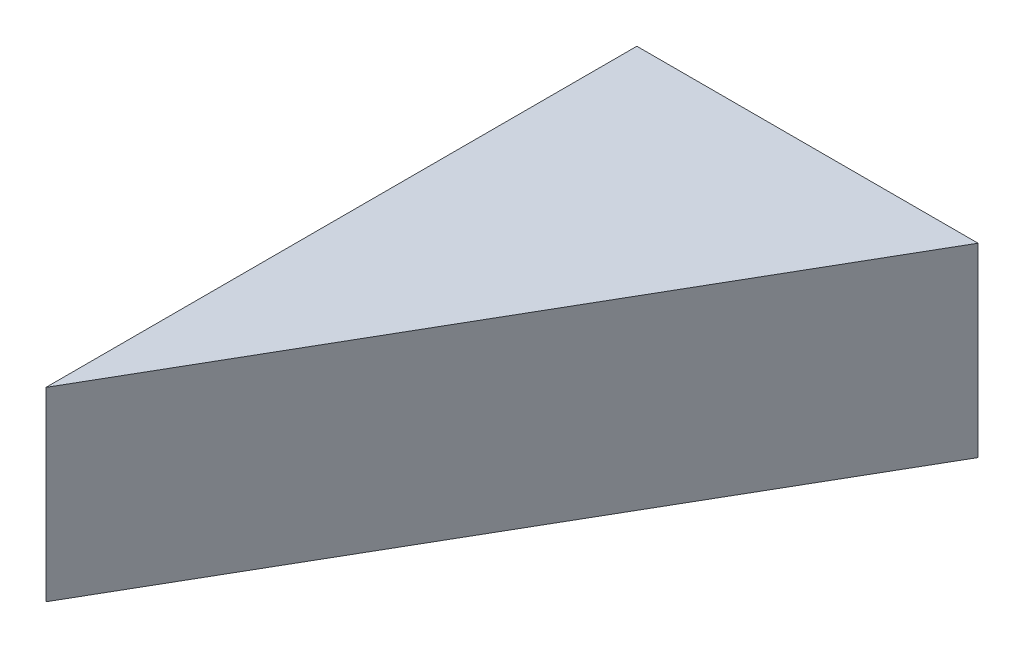
ISO-10303-21;
HEADER;
FILE_DESCRIPTION(('STEP AP214'),'2;1');
FILE_NAME('part.step','',(''),(''),'','','');
FILE_SCHEMA(('AUTOMOTIVE_DESIGN { 1 0 10303 214 1 1 1 1 }'));
ENDSEC;
DATA;
#1=APPLICATION_CONTEXT('core data for automotive mechanical design processes');
#2=APPLICATION_PROTOCOL_DEFINITION('international standard','automotive_design',2000,#1);
#3=PRODUCT_CONTEXT('',#1,'mechanical');
#4=PRODUCT('Part','Part','',(#3));
#5=PRODUCT_RELATED_PRODUCT_CATEGORY('part','',(#4));
#6=PRODUCT_DEFINITION_FORMATION('','',#4);
#7=PRODUCT_DEFINITION_CONTEXT('part definition',#1,'design');
#8=PRODUCT_DEFINITION('design','',#6,#7);
#9=PRODUCT_DEFINITION_SHAPE('','',#8);
#10=(LENGTH_UNIT() NAMED_UNIT(*) SI_UNIT(.MILLI.,.METRE.));
#11=(NAMED_UNIT(*) PLANE_ANGLE_UNIT() SI_UNIT($,.RADIAN.));
#12=(NAMED_UNIT(*) SI_UNIT($,.STERADIAN.) SOLID_ANGLE_UNIT());
#13=UNCERTAINTY_MEASURE_WITH_UNIT(LENGTH_MEASURE(1.E-05),#10,'distance_accuracy_value','');
#14=(GEOMETRIC_REPRESENTATION_CONTEXT(3) GLOBAL_UNCERTAINTY_ASSIGNED_CONTEXT((#13)) GLOBAL_UNIT_ASSIGNED_CONTEXT((#10,
#11,#12)) REPRESENTATION_CONTEXT('',''));
#15=CARTESIAN_POINT('',(0.,0.,0.));
#16=DIRECTION('',(0.,0.,1.));
#17=DIRECTION('',(1.,0.,0.));
#18=AXIS2_PLACEMENT_3D('',#15,#16,#17);
#19=CARTESIAN_POINT('',(0.,-360.,0.));
#20=DIRECTION('',(-1.,0.,0.));
#21=DIRECTION('',(0.,0.,1.));
#22=AXIS2_PLACEMENT_3D('',#19,#20,#21);
#23=PLANE('',#22);
#24=DIRECTION('',(0.,0.,1.));
#25=VECTOR('',#24,1.);
#26=CARTESIAN_POINT('',(0.,-360.,52.5));
#27=LINE('',#26,#25);
#28=CARTESIAN_POINT('',(0.,-360.,0.));
#29=VERTEX_POINT('',#28);
#30=CARTESIAN_POINT('',(0.,-360.,70.));
#31=VERTEX_POINT('',#30);
#32=EDGE_CURVE('E11',#29,#31,#27,.T.);
#33=ORIENTED_EDGE('',*,*,#32,.T.);
#34=DIRECTION('',(0.,1.,0.));
#35=VECTOR('',#34,1.);
#36=CARTESIAN_POINT('',(0.,-360.,70.));
#37=LINE('',#36,#35);
#38=CARTESIAN_POINT('',(0.,-338.,70.));
#39=VERTEX_POINT('',#38);
#40=EDGE_CURVE('E20',#31,#39,#37,.T.);
#41=ORIENTED_EDGE('',*,*,#40,.T.);
#42=DIRECTION('',(0.,0.,1.));
#43=VECTOR('',#42,1.);
#44=CARTESIAN_POINT('',(0.,-338.,52.5));
#45=LINE('',#44,#43);
#46=CARTESIAN_POINT('',(0.,-338.,0.));
#47=VERTEX_POINT('',#46);
#48=EDGE_CURVE('E93',#47,#39,#45,.T.);
#49=ORIENTED_EDGE('',*,*,#48,.F.);
#50=DIRECTION('',(0.,1.,0.));
#51=VECTOR('',#50,1.);
#52=CARTESIAN_POINT('',(0.,-360.,0.));
#53=LINE('',#52,#51);
#54=EDGE_CURVE('E53',#29,#47,#53,.T.);
#55=ORIENTED_EDGE('',*,*,#54,.F.);
#56=EDGE_LOOP('',(#33,#41,#49,#55));
#57=FACE_BOUND('',#56,.T.);
#58=ADVANCED_FACE('F16',(#57),#23,.T.);
#59=CARTESIAN_POINT('',(40.4145188432737,-360.,0.));
#60=DIRECTION('',(0.,0.,-1.));
#61=DIRECTION('',(0.,-1.,0.));
#62=AXIS2_PLACEMENT_3D('',#59,#60,#61);
#63=PLANE('',#62);
#64=DIRECTION('',(-1.,0.,0.));
#65=VECTOR('',#64,1.);
#66=CARTESIAN_POINT('',(10.1036297108184,-360.,0.));
#67=LINE('',#66,#65);
#68=CARTESIAN_POINT('',(40.4145188432737,-360.,0.));
#69=VERTEX_POINT('',#68);
#70=EDGE_CURVE('E70',#69,#29,#67,.T.);
#71=ORIENTED_EDGE('',*,*,#70,.T.);
#72=ORIENTED_EDGE('',*,*,#54,.T.);
#73=DIRECTION('',(-1.,0.,0.));
#74=VECTOR('',#73,1.);
#75=CARTESIAN_POINT('',(10.1036297108184,-338.,0.));
#76=LINE('',#75,#74);
#77=CARTESIAN_POINT('',(40.4145188432737,-338.,0.));
#78=VERTEX_POINT('',#77);
#79=EDGE_CURVE('E63',#78,#47,#76,.T.);
#80=ORIENTED_EDGE('',*,*,#79,.F.);
#81=DIRECTION('',(0.,1.,0.));
#82=VECTOR('',#81,1.);
#83=CARTESIAN_POINT('',(40.4145188432737,-360.,0.));
#84=LINE('',#83,#82);
#85=EDGE_CURVE('E67',#69,#78,#84,.T.);
#86=ORIENTED_EDGE('',*,*,#85,.F.);
#87=EDGE_LOOP('',(#71,#72,#80,#86));
#88=FACE_BOUND('',#87,.T.);
#89=ADVANCED_FACE('F69',(#88),#63,.T.);
#90=CARTESIAN_POINT('',(0.,-360.,70.));
#91=DIRECTION('',(0.866025403784439,0.,0.5));
#92=DIRECTION('',(0.,-1.,0.));
#93=AXIS2_PLACEMENT_3D('',#90,#91,#92);
#94=PLANE('',#93);
#95=DIRECTION('',(0.5,0.,-0.866025403784439));
#96=VECTOR('',#95,1.);
#97=CARTESIAN_POINT('',(30.3108891324553,-360.,17.5));
#98=LINE('',#97,#96);
#99=EDGE_CURVE('E73',#31,#69,#98,.T.);
#100=ORIENTED_EDGE('',*,*,#99,.T.);
#101=ORIENTED_EDGE('',*,*,#85,.T.);
#102=DIRECTION('',(0.5,0.,-0.866025403784439));
#103=VECTOR('',#102,1.);
#104=CARTESIAN_POINT('',(30.3108891324553,-338.,17.5));
#105=LINE('',#104,#103);
#106=EDGE_CURVE('E74',#39,#78,#105,.T.);
#107=ORIENTED_EDGE('',*,*,#106,.F.);
#108=ORIENTED_EDGE('',*,*,#40,.F.);
#109=EDGE_LOOP('',(#100,#101,#107,#108));
#110=FACE_BOUND('',#109,.T.);
#111=ADVANCED_FACE('F80',(#110),#94,.T.);
#112=CARTESIAN_POINT('',(20.2072594216369,-338.,35.));
#113=DIRECTION('',(0.,1.,0.));
#114=DIRECTION('',(1.,0.,0.));
#115=AXIS2_PLACEMENT_3D('',#112,#113,#114);
#116=PLANE('',#115);
#117=ORIENTED_EDGE('',*,*,#106,.T.);
#118=ORIENTED_EDGE('',*,*,#79,.T.);
#119=ORIENTED_EDGE('',*,*,#48,.T.);
#120=EDGE_LOOP('',(#117,#118,#119));
#121=FACE_BOUND('',#120,.T.);
#122=ADVANCED_FACE('F101',(#121),#116,.T.);
#123=CARTESIAN_POINT('',(20.2072594216369,-360.,35.));
#124=DIRECTION('',(0.,-1.,0.));
#125=DIRECTION('',(0.,0.,-1.));
#126=AXIS2_PLACEMENT_3D('',#123,#124,#125);
#127=PLANE('',#126);
#128=ORIENTED_EDGE('',*,*,#99,.F.);
#129=ORIENTED_EDGE('',*,*,#32,.F.);
#130=ORIENTED_EDGE('',*,*,#70,.F.);
#131=EDGE_LOOP('',(#128,#129,#130));
#132=FACE_BOUND('',#131,.T.);
#133=ADVANCED_FACE('F18',(#132),#127,.T.);
#134=CLOSED_SHELL('',(#58,#89,#111,#122,#133));
#135=MANIFOLD_SOLID_BREP('B1',#134);
#136=ADVANCED_BREP_SHAPE_REPRESENTATION('',(#18,#135),#14);
#137=SHAPE_DEFINITION_REPRESENTATION(#9,#136);
ENDSEC;
END-ISO-10303-21;
